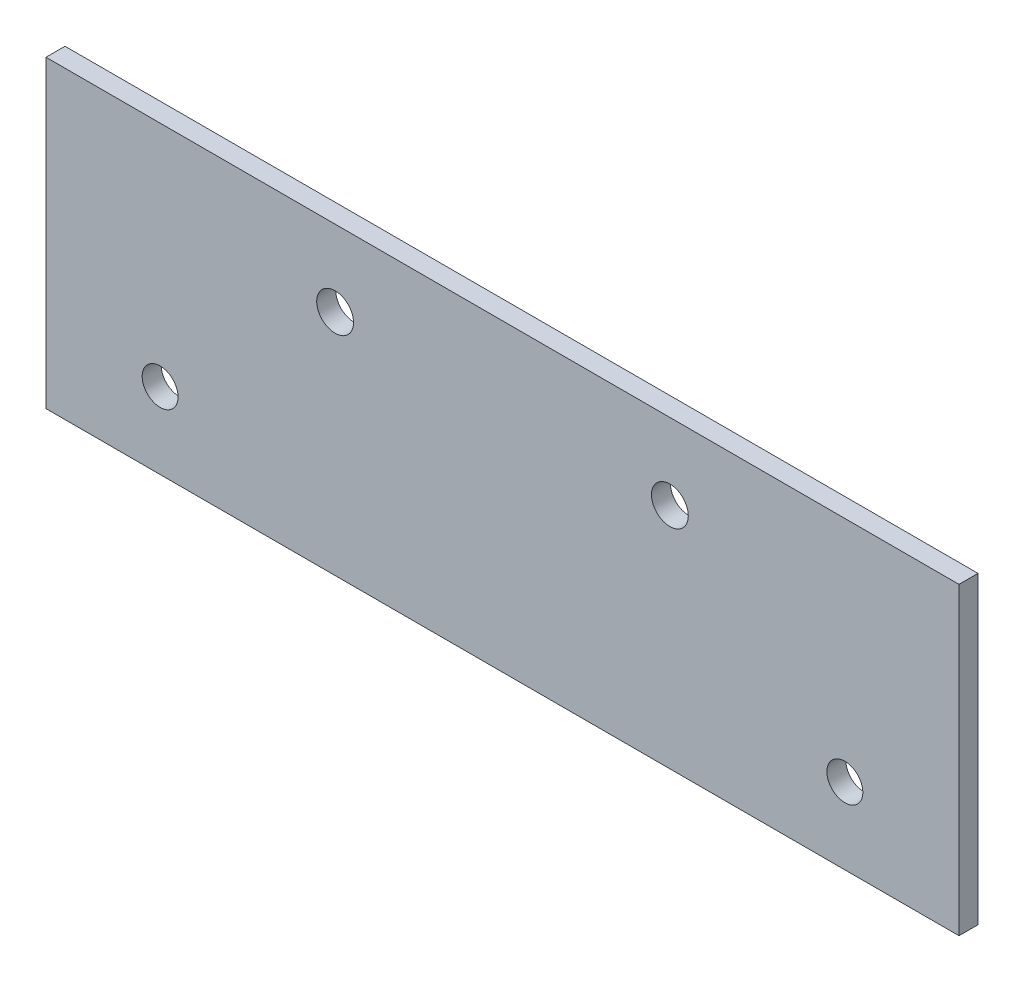
ISO-10303-21;
HEADER;
FILE_DESCRIPTION(('STEP AP214'),'2;1');
FILE_NAME('part.step','',(''),(''),'','','');
FILE_SCHEMA(('AUTOMOTIVE_DESIGN { 1 0 10303 214 1 1 1 1 }'));
ENDSEC;
DATA;
#1=APPLICATION_CONTEXT('core data for automotive mechanical design processes');
#2=APPLICATION_PROTOCOL_DEFINITION('international standard','automotive_design',2000,#1);
#3=PRODUCT_CONTEXT('',#1,'mechanical');
#4=PRODUCT('Part','Part','',(#3));
#5=PRODUCT_RELATED_PRODUCT_CATEGORY('part','',(#4));
#6=PRODUCT_DEFINITION_FORMATION('','',#4);
#7=PRODUCT_DEFINITION_CONTEXT('part definition',#1,'design');
#8=PRODUCT_DEFINITION('design','',#6,#7);
#9=PRODUCT_DEFINITION_SHAPE('','',#8);
#10=(LENGTH_UNIT() NAMED_UNIT(*) SI_UNIT(.MILLI.,.METRE.));
#11=(NAMED_UNIT(*) PLANE_ANGLE_UNIT() SI_UNIT($,.RADIAN.));
#12=(NAMED_UNIT(*) SI_UNIT($,.STERADIAN.) SOLID_ANGLE_UNIT());
#13=UNCERTAINTY_MEASURE_WITH_UNIT(LENGTH_MEASURE(1.E-05),#10,'distance_accuracy_value','');
#14=(GEOMETRIC_REPRESENTATION_CONTEXT(3) GLOBAL_UNCERTAINTY_ASSIGNED_CONTEXT((#13)) GLOBAL_UNIT_ASSIGNED_CONTEXT((#10,
#11,#12)) REPRESENTATION_CONTEXT('',''));
#15=CARTESIAN_POINT('',(0.,0.,0.));
#16=DIRECTION('',(0.,0.,1.));
#17=DIRECTION('',(1.,0.,0.));
#18=AXIS2_PLACEMENT_3D('',#15,#16,#17);
#19=CARTESIAN_POINT('',(0.,0.,3.175));
#20=DIRECTION('',(0.,0.,-1.));
#21=DIRECTION('',(-1.,0.,0.));
#22=AXIS2_PLACEMENT_3D('',#19,#20,#21);
#23=PLANE('',#22);
#24=DIRECTION('',(0.,-1.,0.));
#25=VECTOR('',#24,1.);
#26=CARTESIAN_POINT('',(-76.2,-12.7,3.175));
#27=LINE('',#26,#25);
#28=CARTESIAN_POINT('',(-76.2,38.1,3.175));
#29=VERTEX_POINT('',#28);
#30=CARTESIAN_POINT('',(-76.2,-12.7,3.175));
#31=VERTEX_POINT('',#30);
#32=EDGE_CURVE('E91',#29,#31,#27,.T.);
#33=ORIENTED_EDGE('',*,*,#32,.T.);
#34=DIRECTION('',(1.,0.,0.));
#35=VECTOR('',#34,1.);
#36=CARTESIAN_POINT('',(-76.2,-12.7,3.175));
#37=LINE('',#36,#35);
#38=CARTESIAN_POINT('',(76.2,-12.7,3.175));
#39=VERTEX_POINT('',#38);
#40=EDGE_CURVE('E86',#31,#39,#37,.T.);
#41=ORIENTED_EDGE('',*,*,#40,.T.);
#42=DIRECTION('',(0.,1.,0.));
#43=VECTOR('',#42,1.);
#44=CARTESIAN_POINT('',(76.2,-12.7,3.175));
#45=LINE('',#44,#43);
#46=CARTESIAN_POINT('',(76.2,38.1,3.175));
#47=VERTEX_POINT('',#46);
#48=EDGE_CURVE('E89',#39,#47,#45,.T.);
#49=ORIENTED_EDGE('',*,*,#48,.T.);
#50=DIRECTION('',(-1.,0.,0.));
#51=VECTOR('',#50,1.);
#52=CARTESIAN_POINT('',(-76.2,38.1,3.175));
#53=LINE('',#52,#51);
#54=EDGE_CURVE('E56',#47,#29,#53,.T.);
#55=ORIENTED_EDGE('',*,*,#54,.T.);
#56=EDGE_LOOP('',(#33,#41,#49,#55));
#57=FACE_BOUND('',#56,.T.);
#58=CARTESIAN_POINT('',(-27.94,25.4,3.175));
#59=DIRECTION('',(0.,0.,1.));
#60=DIRECTION('',(1.,0.,0.));
#61=AXIS2_PLACEMENT_3D('',#58,#59,#60);
#62=CIRCLE('',#61,3.0734);
#63=CARTESIAN_POINT('',(-24.8666,25.4,3.175));
#64=VERTEX_POINT('',#63);
#65=EDGE_CURVE('E106',#64,#64,#62,.T.);
#66=ORIENTED_EDGE('',*,*,#65,.F.);
#67=EDGE_LOOP('',(#66));
#68=FACE_BOUND('',#67,.T.);
#69=CARTESIAN_POINT('',(27.94,25.4,3.175));
#70=DIRECTION('',(0.,0.,1.));
#71=DIRECTION('',(1.,0.,0.));
#72=AXIS2_PLACEMENT_3D('',#69,#70,#71);
#73=CIRCLE('',#72,3.0734);
#74=CARTESIAN_POINT('',(31.0134,25.4,3.175));
#75=VERTEX_POINT('',#74);
#76=EDGE_CURVE('E121',#75,#75,#73,.T.);
#77=ORIENTED_EDGE('',*,*,#76,.F.);
#78=EDGE_LOOP('',(#77));
#79=FACE_BOUND('',#78,.T.);
#80=CARTESIAN_POINT('',(-57.15,0.,3.175));
#81=DIRECTION('',(0.,0.,1.));
#82=DIRECTION('',(1.,0.,0.));
#83=AXIS2_PLACEMENT_3D('',#80,#81,#82);
#84=CIRCLE('',#83,2.99999999999999);
#85=CARTESIAN_POINT('',(-54.15,0.,3.175));
#86=VERTEX_POINT('',#85);
#87=EDGE_CURVE('E127',#86,#86,#84,.T.);
#88=ORIENTED_EDGE('',*,*,#87,.F.);
#89=EDGE_LOOP('',(#88));
#90=FACE_BOUND('',#89,.T.);
#91=CARTESIAN_POINT('',(57.15,0.,3.175));
#92=DIRECTION('',(0.,0.,1.));
#93=DIRECTION('',(1.,0.,0.));
#94=AXIS2_PLACEMENT_3D('',#91,#92,#93);
#95=CIRCLE('',#94,3.00000000000002);
#96=CARTESIAN_POINT('',(60.15,0.,3.175));
#97=VERTEX_POINT('',#96);
#98=EDGE_CURVE('E133',#97,#97,#95,.T.);
#99=ORIENTED_EDGE('',*,*,#98,.F.);
#100=EDGE_LOOP('',(#99));
#101=FACE_BOUND('',#100,.T.);
#102=ADVANCED_FACE('F39',(#57,#68,#79,#90,#101),#23,.F.);
#103=CARTESIAN_POINT('',(0.,0.,0.));
#104=DIRECTION('',(0.,0.,-1.));
#105=DIRECTION('',(-1.,0.,0.));
#106=AXIS2_PLACEMENT_3D('',#103,#104,#105);
#107=PLANE('',#106);
#108=CARTESIAN_POINT('',(-57.15,0.,0.));
#109=DIRECTION('',(0.,0.,1.));
#110=DIRECTION('',(1.,0.,0.));
#111=AXIS2_PLACEMENT_3D('',#108,#109,#110);
#112=CIRCLE('',#111,2.99999999999999);
#113=CARTESIAN_POINT('',(-54.15,0.,0.));
#114=VERTEX_POINT('',#113);
#115=EDGE_CURVE('E130',#114,#114,#112,.T.);
#116=ORIENTED_EDGE('',*,*,#115,.T.);
#117=EDGE_LOOP('',(#116));
#118=FACE_BOUND('',#117,.T.);
#119=CARTESIAN_POINT('',(-27.94,25.4,0.));
#120=DIRECTION('',(0.,0.,1.));
#121=DIRECTION('',(1.,0.,0.));
#122=AXIS2_PLACEMENT_3D('',#119,#120,#121);
#123=CIRCLE('',#122,3.0734);
#124=CARTESIAN_POINT('',(-24.8666,25.4,0.));
#125=VERTEX_POINT('',#124);
#126=EDGE_CURVE('E118',#125,#125,#123,.T.);
#127=ORIENTED_EDGE('',*,*,#126,.T.);
#128=EDGE_LOOP('',(#127));
#129=FACE_BOUND('',#128,.T.);
#130=DIRECTION('',(0.,-1.,0.));
#131=VECTOR('',#130,1.);
#132=CARTESIAN_POINT('',(-76.2,-12.7,0.));
#133=LINE('',#132,#131);
#134=CARTESIAN_POINT('',(-76.2,38.1,0.));
#135=VERTEX_POINT('',#134);
#136=CARTESIAN_POINT('',(-76.2,-12.7,0.));
#137=VERTEX_POINT('',#136);
#138=EDGE_CURVE('E103',#135,#137,#133,.T.);
#139=ORIENTED_EDGE('',*,*,#138,.F.);
#140=DIRECTION('',(-1.,0.,0.));
#141=VECTOR('',#140,1.);
#142=CARTESIAN_POINT('',(-76.2,38.1,0.));
#143=LINE('',#142,#141);
#144=CARTESIAN_POINT('',(76.2,38.1,0.));
#145=VERTEX_POINT('',#144);
#146=EDGE_CURVE('E79',#145,#135,#143,.T.);
#147=ORIENTED_EDGE('',*,*,#146,.F.);
#148=DIRECTION('',(0.,1.,0.));
#149=VECTOR('',#148,1.);
#150=CARTESIAN_POINT('',(76.2,-12.7,0.));
#151=LINE('',#150,#149);
#152=CARTESIAN_POINT('',(76.2,-12.7,0.));
#153=VERTEX_POINT('',#152);
#154=EDGE_CURVE('E73',#153,#145,#151,.T.);
#155=ORIENTED_EDGE('',*,*,#154,.F.);
#156=DIRECTION('',(1.,0.,0.));
#157=VECTOR('',#156,1.);
#158=CARTESIAN_POINT('',(-76.2,-12.7,0.));
#159=LINE('',#158,#157);
#160=EDGE_CURVE('E95',#137,#153,#159,.T.);
#161=ORIENTED_EDGE('',*,*,#160,.F.);
#162=EDGE_LOOP('',(#139,#147,#155,#161));
#163=FACE_BOUND('',#162,.T.);
#164=CARTESIAN_POINT('',(27.94,25.4,0.));
#165=DIRECTION('',(0.,0.,1.));
#166=DIRECTION('',(1.,0.,0.));
#167=AXIS2_PLACEMENT_3D('',#164,#165,#166);
#168=CIRCLE('',#167,3.0734);
#169=CARTESIAN_POINT('',(31.0134,25.4,0.));
#170=VERTEX_POINT('',#169);
#171=EDGE_CURVE('E124',#170,#170,#168,.T.);
#172=ORIENTED_EDGE('',*,*,#171,.T.);
#173=EDGE_LOOP('',(#172));
#174=FACE_BOUND('',#173,.T.);
#175=CARTESIAN_POINT('',(57.15,0.,0.));
#176=DIRECTION('',(0.,0.,1.));
#177=DIRECTION('',(1.,0.,0.));
#178=AXIS2_PLACEMENT_3D('',#175,#176,#177);
#179=CIRCLE('',#178,3.00000000000002);
#180=CARTESIAN_POINT('',(60.15,0.,0.));
#181=VERTEX_POINT('',#180);
#182=EDGE_CURVE('E136',#181,#181,#179,.T.);
#183=ORIENTED_EDGE('',*,*,#182,.T.);
#184=EDGE_LOOP('',(#183));
#185=FACE_BOUND('',#184,.T.);
#186=ADVANCED_FACE('F114',(#118,#129,#163,#174,#185),#107,.T.);
#187=CARTESIAN_POINT('',(-76.2,-12.7,3.175));
#188=DIRECTION('',(1.,0.,0.));
#189=DIRECTION('',(0.,0.,-1.));
#190=AXIS2_PLACEMENT_3D('',#187,#188,#189);
#191=PLANE('',#190);
#192=ORIENTED_EDGE('',*,*,#138,.T.);
#193=DIRECTION('',(0.,0.,-1.));
#194=VECTOR('',#193,1.);
#195=CARTESIAN_POINT('',(-76.2,-12.7,3.175));
#196=LINE('',#195,#194);
#197=EDGE_CURVE('E11',#31,#137,#196,.T.);
#198=ORIENTED_EDGE('',*,*,#197,.F.);
#199=ORIENTED_EDGE('',*,*,#32,.F.);
#200=DIRECTION('',(0.,0.,-1.));
#201=VECTOR('',#200,1.);
#202=CARTESIAN_POINT('',(-76.2,38.1,3.175));
#203=LINE('',#202,#201);
#204=EDGE_CURVE('E99',#29,#135,#203,.T.);
#205=ORIENTED_EDGE('',*,*,#204,.T.);
#206=EDGE_LOOP('',(#192,#198,#199,#205));
#207=FACE_BOUND('',#206,.T.);
#208=ADVANCED_FACE('F41',(#207),#191,.F.);
#209=CARTESIAN_POINT('',(-76.2,-12.7,3.175));
#210=DIRECTION('',(0.,1.,0.));
#211=DIRECTION('',(0.,0.,1.));
#212=AXIS2_PLACEMENT_3D('',#209,#210,#211);
#213=PLANE('',#212);
#214=ORIENTED_EDGE('',*,*,#160,.T.);
#215=DIRECTION('',(0.,0.,-1.));
#216=VECTOR('',#215,1.);
#217=CARTESIAN_POINT('',(76.2,-12.7,3.175));
#218=LINE('',#217,#216);
#219=EDGE_CURVE('E48',#39,#153,#218,.T.);
#220=ORIENTED_EDGE('',*,*,#219,.F.);
#221=ORIENTED_EDGE('',*,*,#40,.F.);
#222=ORIENTED_EDGE('',*,*,#197,.T.);
#223=EDGE_LOOP('',(#214,#220,#221,#222));
#224=FACE_BOUND('',#223,.T.);
#225=ADVANCED_FACE('F94',(#224),#213,.F.);
#226=CARTESIAN_POINT('',(76.2,-12.7,3.175));
#227=DIRECTION('',(-1.,0.,0.));
#228=DIRECTION('',(0.,0.,1.));
#229=AXIS2_PLACEMENT_3D('',#226,#227,#228);
#230=PLANE('',#229);
#231=ORIENTED_EDGE('',*,*,#154,.T.);
#232=DIRECTION('',(0.,0.,-1.));
#233=VECTOR('',#232,1.);
#234=CARTESIAN_POINT('',(76.2,38.1,3.175));
#235=LINE('',#234,#233);
#236=EDGE_CURVE('E96',#47,#145,#235,.T.);
#237=ORIENTED_EDGE('',*,*,#236,.F.);
#238=ORIENTED_EDGE('',*,*,#48,.F.);
#239=ORIENTED_EDGE('',*,*,#219,.T.);
#240=EDGE_LOOP('',(#231,#237,#238,#239));
#241=FACE_BOUND('',#240,.T.);
#242=ADVANCED_FACE('F97',(#241),#230,.F.);
#243=CARTESIAN_POINT('',(-76.2,38.1,3.175));
#244=DIRECTION('',(0.,-1.,0.));
#245=DIRECTION('',(0.,0.,-1.));
#246=AXIS2_PLACEMENT_3D('',#243,#244,#245);
#247=PLANE('',#246);
#248=ORIENTED_EDGE('',*,*,#146,.T.);
#249=ORIENTED_EDGE('',*,*,#204,.F.);
#250=ORIENTED_EDGE('',*,*,#54,.F.);
#251=ORIENTED_EDGE('',*,*,#236,.T.);
#252=EDGE_LOOP('',(#248,#249,#250,#251));
#253=FACE_BOUND('',#252,.T.);
#254=ADVANCED_FACE('F111',(#253),#247,.F.);
#255=CARTESIAN_POINT('',(-27.94,25.4,3.175));
#256=DIRECTION('',(0.,0.,-1.));
#257=DIRECTION('',(-1.,0.,0.));
#258=AXIS2_PLACEMENT_3D('',#255,#256,#257);
#259=CYLINDRICAL_SURFACE('',#258,3.0734);
#260=ORIENTED_EDGE('',*,*,#65,.T.);
#261=EDGE_LOOP('',(#260));
#262=FACE_BOUND('',#261,.T.);
#263=ORIENTED_EDGE('',*,*,#126,.F.);
#264=EDGE_LOOP('',(#263));
#265=FACE_BOUND('',#264,.T.);
#266=ADVANCED_FACE('F153',(#262,#265),#259,.F.);
#267=CARTESIAN_POINT('',(27.94,25.4,3.175));
#268=DIRECTION('',(0.,0.,-1.));
#269=DIRECTION('',(-1.,0.,0.));
#270=AXIS2_PLACEMENT_3D('',#267,#268,#269);
#271=CYLINDRICAL_SURFACE('',#270,3.0734);
#272=ORIENTED_EDGE('',*,*,#76,.T.);
#273=EDGE_LOOP('',(#272));
#274=FACE_BOUND('',#273,.T.);
#275=ORIENTED_EDGE('',*,*,#171,.F.);
#276=EDGE_LOOP('',(#275));
#277=FACE_BOUND('',#276,.T.);
#278=ADVANCED_FACE('F198',(#274,#277),#271,.F.);
#279=CARTESIAN_POINT('',(-57.15,0.,3.175));
#280=DIRECTION('',(0.,0.,-1.));
#281=DIRECTION('',(-1.,0.,0.));
#282=AXIS2_PLACEMENT_3D('',#279,#280,#281);
#283=CYLINDRICAL_SURFACE('',#282,2.99999999999999);
#284=ORIENTED_EDGE('',*,*,#87,.T.);
#285=EDGE_LOOP('',(#284));
#286=FACE_BOUND('',#285,.T.);
#287=ORIENTED_EDGE('',*,*,#115,.F.);
#288=EDGE_LOOP('',(#287));
#289=FACE_BOUND('',#288,.T.);
#290=ADVANCED_FACE('F206',(#286,#289),#283,.F.);
#291=CARTESIAN_POINT('',(57.15,0.,3.175));
#292=DIRECTION('',(0.,0.,-1.));
#293=DIRECTION('',(-1.,0.,0.));
#294=AXIS2_PLACEMENT_3D('',#291,#292,#293);
#295=CYLINDRICAL_SURFACE('',#294,3.00000000000002);
#296=ORIENTED_EDGE('',*,*,#98,.T.);
#297=EDGE_LOOP('',(#296));
#298=FACE_BOUND('',#297,.T.);
#299=ORIENTED_EDGE('',*,*,#182,.F.);
#300=EDGE_LOOP('',(#299));
#301=FACE_BOUND('',#300,.T.);
#302=ADVANCED_FACE('F142',(#298,#301),#295,.F.);
#303=CLOSED_SHELL('',(#102,#186,#208,#225,#242,#254,#266,#278,#290,#302));
#304=MANIFOLD_SOLID_BREP('B2',#303);
#305=ADVANCED_BREP_SHAPE_REPRESENTATION('',(#18,#304),#14);
#306=SHAPE_DEFINITION_REPRESENTATION(#9,#305);
ENDSEC;
END-ISO-10303-21;
